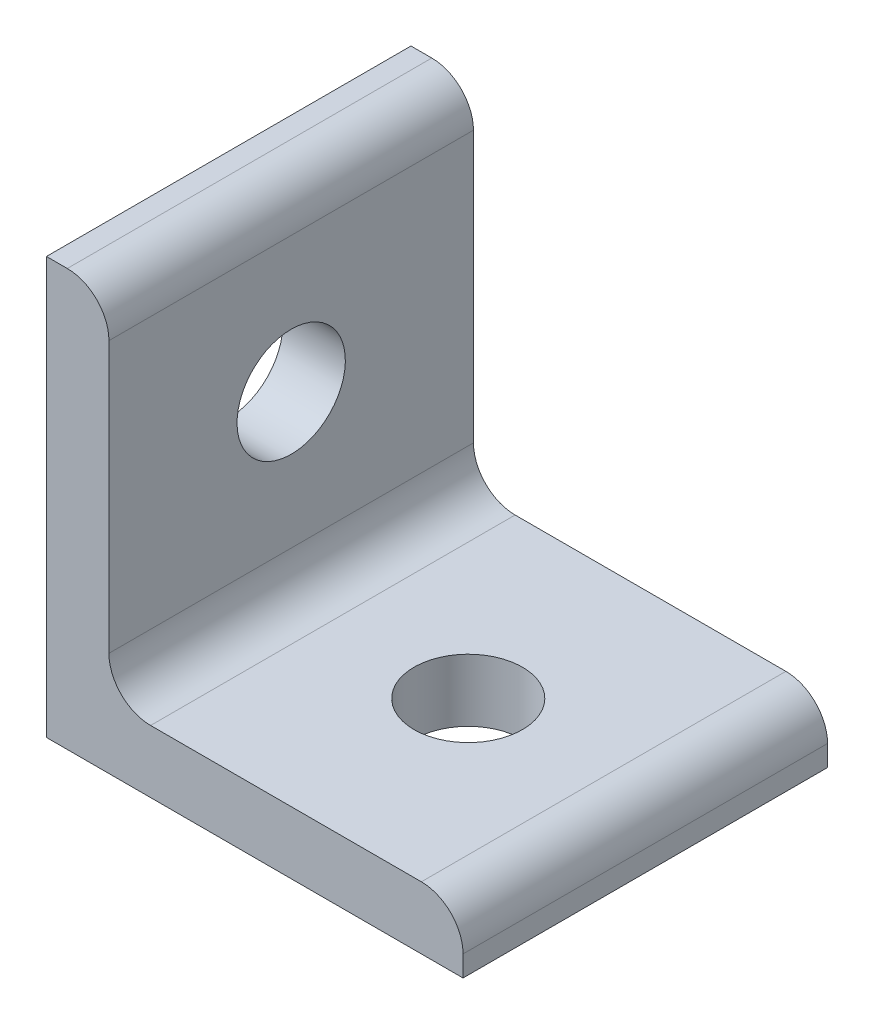
ISO-10303-21;
HEADER;
FILE_DESCRIPTION(('STEP AP214'),'2;1');
FILE_NAME('part.step','',(''),(''),'','','');
FILE_SCHEMA(('AUTOMOTIVE_DESIGN { 1 0 10303 214 1 1 1 1 }'));
ENDSEC;
DATA;
#1=APPLICATION_CONTEXT('core data for automotive mechanical design processes');
#2=APPLICATION_PROTOCOL_DEFINITION('international standard','automotive_design',2000,#1);
#3=PRODUCT_CONTEXT('',#1,'mechanical');
#4=PRODUCT('Part','Part','',(#3));
#5=PRODUCT_RELATED_PRODUCT_CATEGORY('part','',(#4));
#6=PRODUCT_DEFINITION_FORMATION('','',#4);
#7=PRODUCT_DEFINITION_CONTEXT('part definition',#1,'design');
#8=PRODUCT_DEFINITION('design','',#6,#7);
#9=PRODUCT_DEFINITION_SHAPE('','',#8);
#10=(LENGTH_UNIT() NAMED_UNIT(*) SI_UNIT(.MILLI.,.METRE.));
#11=(NAMED_UNIT(*) PLANE_ANGLE_UNIT() SI_UNIT($,.RADIAN.));
#12=(NAMED_UNIT(*) SI_UNIT($,.STERADIAN.) SOLID_ANGLE_UNIT());
#13=UNCERTAINTY_MEASURE_WITH_UNIT(LENGTH_MEASURE(1.E-05),#10,'distance_accuracy_value','');
#14=(GEOMETRIC_REPRESENTATION_CONTEXT(3) GLOBAL_UNCERTAINTY_ASSIGNED_CONTEXT((#13)) GLOBAL_UNIT_ASSIGNED_CONTEXT((#10,
#11,#12)) REPRESENTATION_CONTEXT('',''));
#15=CARTESIAN_POINT('',(0.,0.,0.));
#16=DIRECTION('',(0.,0.,1.));
#17=DIRECTION('',(1.,0.,0.));
#18=AXIS2_PLACEMENT_3D('',#15,#16,#17);
#19=CARTESIAN_POINT('',(-3.81,21.59,22.225));
#20=DIRECTION('',(0.,-1.,0.));
#21=DIRECTION('',(0.,0.,-1.));
#22=AXIS2_PLACEMENT_3D('',#19,#20,#21);
#23=PLANE('',#22);
#24=DIRECTION('',(-1.,0.,0.));
#25=VECTOR('',#24,1.);
#26=CARTESIAN_POINT('',(-3.81,21.59,22.225));
#27=LINE('',#26,#25);
#28=CARTESIAN_POINT('',(-2.54,21.59,22.225));
#29=VERTEX_POINT('',#28);
#30=CARTESIAN_POINT('',(-3.81,21.59,22.225));
#31=VERTEX_POINT('',#30);
#32=EDGE_CURVE('E114',#29,#31,#27,.T.);
#33=ORIENTED_EDGE('',*,*,#32,.F.);
#34=DIRECTION('',(0.,0.,-1.));
#35=VECTOR('',#34,1.);
#36=CARTESIAN_POINT('',(-2.54,21.59,22.225));
#37=LINE('',#36,#35);
#38=CARTESIAN_POINT('',(-2.54,21.59,0.));
#39=VERTEX_POINT('',#38);
#40=EDGE_CURVE('E173',#29,#39,#37,.T.);
#41=ORIENTED_EDGE('',*,*,#40,.T.);
#42=DIRECTION('',(-1.,0.,0.));
#43=VECTOR('',#42,1.);
#44=CARTESIAN_POINT('',(-3.81,21.59,0.));
#45=LINE('',#44,#43);
#46=CARTESIAN_POINT('',(-3.81,21.59,0.));
#47=VERTEX_POINT('',#46);
#48=EDGE_CURVE('E137',#39,#47,#45,.T.);
#49=ORIENTED_EDGE('',*,*,#48,.T.);
#50=DIRECTION('',(0.,0.,-1.));
#51=VECTOR('',#50,1.);
#52=CARTESIAN_POINT('',(-3.81,21.59,22.225));
#53=LINE('',#52,#51);
#54=EDGE_CURVE('E129',#31,#47,#53,.T.);
#55=ORIENTED_EDGE('',*,*,#54,.F.);
#56=EDGE_LOOP('',(#33,#41,#49,#55));
#57=FACE_BOUND('',#56,.T.);
#58=ADVANCED_FACE('F43',(#57),#23,.F.);
#59=CARTESIAN_POINT('',(-3.81,-3.81,22.225));
#60=DIRECTION('',(1.,0.,0.));
#61=DIRECTION('',(0.,1.,0.));
#62=AXIS2_PLACEMENT_3D('',#59,#60,#61);
#63=PLANE('',#62);
#64=CARTESIAN_POINT('',(-3.81,10.795,11.1125));
#65=DIRECTION('',(1.,0.,0.));
#66=DIRECTION('',(0.,1.,0.));
#67=AXIS2_PLACEMENT_3D('',#64,#65,#66);
#68=CIRCLE('',#67,3.302);
#69=CARTESIAN_POINT('',(-3.81,14.097,11.1125));
#70=VERTEX_POINT('',#69);
#71=EDGE_CURVE('E237',#70,#70,#68,.T.);
#72=ORIENTED_EDGE('',*,*,#71,.T.);
#73=EDGE_LOOP('',(#72));
#74=FACE_BOUND('',#73,.T.);
#75=DIRECTION('',(0.,-1.,0.));
#76=VECTOR('',#75,1.);
#77=CARTESIAN_POINT('',(-3.81,-3.81,0.));
#78=LINE('',#77,#76);
#79=CARTESIAN_POINT('',(-3.81,-3.81,0.));
#80=VERTEX_POINT('',#79);
#81=EDGE_CURVE('E213',#47,#80,#78,.T.);
#82=ORIENTED_EDGE('',*,*,#81,.T.);
#83=DIRECTION('',(0.,0.,-1.));
#84=VECTOR('',#83,1.);
#85=CARTESIAN_POINT('',(-3.81,-3.81,22.225));
#86=LINE('',#85,#84);
#87=CARTESIAN_POINT('',(-3.81,-3.81,22.225));
#88=VERTEX_POINT('',#87);
#89=EDGE_CURVE('E131',#88,#80,#86,.T.);
#90=ORIENTED_EDGE('',*,*,#89,.F.);
#91=DIRECTION('',(0.,-1.,0.));
#92=VECTOR('',#91,1.);
#93=CARTESIAN_POINT('',(-3.81,-3.81,22.225));
#94=LINE('',#93,#92);
#95=EDGE_CURVE('E117',#31,#88,#94,.T.);
#96=ORIENTED_EDGE('',*,*,#95,.F.);
#97=ORIENTED_EDGE('',*,*,#54,.T.);
#98=EDGE_LOOP('',(#82,#90,#96,#97));
#99=FACE_BOUND('',#98,.T.);
#100=ADVANCED_FACE('F128',(#74,#99),#63,.F.);
#101=CARTESIAN_POINT('',(21.59,-3.81,22.225));
#102=DIRECTION('',(0.,1.,0.));
#103=DIRECTION('',(-1.,0.,0.));
#104=AXIS2_PLACEMENT_3D('',#101,#102,#103);
#105=PLANE('',#104);
#106=CARTESIAN_POINT('',(10.795,-3.81,11.1125));
#107=DIRECTION('',(0.,1.,0.));
#108=DIRECTION('',(0.,0.,1.));
#109=AXIS2_PLACEMENT_3D('',#106,#107,#108);
#110=CIRCLE('',#109,3.302);
#111=CARTESIAN_POINT('',(10.795,-3.81,14.4145));
#112=VERTEX_POINT('',#111);
#113=EDGE_CURVE('E214',#112,#112,#110,.T.);
#114=ORIENTED_EDGE('',*,*,#113,.T.);
#115=EDGE_LOOP('',(#114));
#116=FACE_BOUND('',#115,.T.);
#117=DIRECTION('',(1.,0.,0.));
#118=VECTOR('',#117,1.);
#119=CARTESIAN_POINT('',(21.59,-3.81,0.));
#120=LINE('',#119,#118);
#121=CARTESIAN_POINT('',(21.59,-3.81,0.));
#122=VERTEX_POINT('',#121);
#123=EDGE_CURVE('E217',#80,#122,#120,.T.);
#124=ORIENTED_EDGE('',*,*,#123,.T.);
#125=DIRECTION('',(0.,0.,-1.));
#126=VECTOR('',#125,1.);
#127=CARTESIAN_POINT('',(21.59,-3.81,22.225));
#128=LINE('',#127,#126);
#129=CARTESIAN_POINT('',(21.59,-3.81,22.225));
#130=VERTEX_POINT('',#129);
#131=EDGE_CURVE('E146',#130,#122,#128,.T.);
#132=ORIENTED_EDGE('',*,*,#131,.F.);
#133=DIRECTION('',(1.,0.,0.));
#134=VECTOR('',#133,1.);
#135=CARTESIAN_POINT('',(21.59,-3.81,22.225));
#136=LINE('',#135,#134);
#137=EDGE_CURVE('E134',#88,#130,#136,.T.);
#138=ORIENTED_EDGE('',*,*,#137,.F.);
#139=ORIENTED_EDGE('',*,*,#89,.T.);
#140=EDGE_LOOP('',(#124,#132,#138,#139));
#141=FACE_BOUND('',#140,.T.);
#142=ADVANCED_FACE('F227',(#116,#141),#105,.F.);
#143=CARTESIAN_POINT('',(21.59,0.,22.225));
#144=DIRECTION('',(-1.,0.,0.));
#145=DIRECTION('',(0.,0.,1.));
#146=AXIS2_PLACEMENT_3D('',#143,#144,#145);
#147=PLANE('',#146);
#148=DIRECTION('',(0.,1.,0.));
#149=VECTOR('',#148,1.);
#150=CARTESIAN_POINT('',(21.59,0.,0.));
#151=LINE('',#150,#149);
#152=CARTESIAN_POINT('',(21.59,-2.54,0.));
#153=VERTEX_POINT('',#152);
#154=EDGE_CURVE('E192',#122,#153,#151,.T.);
#155=ORIENTED_EDGE('',*,*,#154,.T.);
#156=DIRECTION('',(0.,0.,-1.));
#157=VECTOR('',#156,1.);
#158=CARTESIAN_POINT('',(21.59,-2.54,22.225));
#159=LINE('',#158,#157);
#160=CARTESIAN_POINT('',(21.59,-2.54,22.225));
#161=VERTEX_POINT('',#160);
#162=EDGE_CURVE('E67',#153,#161,#159,.F.);
#163=ORIENTED_EDGE('',*,*,#162,.T.);
#164=DIRECTION('',(0.,1.,0.));
#165=VECTOR('',#164,1.);
#166=CARTESIAN_POINT('',(21.59,0.,22.225));
#167=LINE('',#166,#165);
#168=EDGE_CURVE('E207',#130,#161,#167,.T.);
#169=ORIENTED_EDGE('',*,*,#168,.F.);
#170=ORIENTED_EDGE('',*,*,#131,.T.);
#171=EDGE_LOOP('',(#155,#163,#169,#170));
#172=FACE_BOUND('',#171,.T.);
#173=ADVANCED_FACE('F264',(#172),#147,.F.);
#174=CARTESIAN_POINT('',(0.,0.,22.225));
#175=DIRECTION('',(0.,-1.,0.));
#176=DIRECTION('',(0.,0.,-1.));
#177=AXIS2_PLACEMENT_3D('',#174,#175,#176);
#178=PLANE('',#177);
#179=CARTESIAN_POINT('',(10.795,0.,11.1125));
#180=DIRECTION('',(0.,1.,0.));
#181=DIRECTION('',(0.,0.,1.));
#182=AXIS2_PLACEMENT_3D('',#179,#180,#181);
#183=CIRCLE('',#182,3.302);
#184=CARTESIAN_POINT('',(10.795,0.,14.4145));
#185=VERTEX_POINT('',#184);
#186=EDGE_CURVE('E233',#185,#185,#183,.T.);
#187=ORIENTED_EDGE('',*,*,#186,.F.);
#188=EDGE_LOOP('',(#187));
#189=FACE_BOUND('',#188,.T.);
#190=DIRECTION('',(-1.,0.,0.));
#191=VECTOR('',#190,1.);
#192=CARTESIAN_POINT('',(0.,0.,0.));
#193=LINE('',#192,#191);
#194=CARTESIAN_POINT('',(19.05,0.,0.));
#195=VERTEX_POINT('',#194);
#196=CARTESIAN_POINT('',(2.54,0.,0.));
#197=VERTEX_POINT('',#196);
#198=EDGE_CURVE('E181',#195,#197,#193,.T.);
#199=ORIENTED_EDGE('',*,*,#198,.T.);
#200=DIRECTION('',(0.,0.,-1.));
#201=VECTOR('',#200,1.);
#202=CARTESIAN_POINT('',(2.54,0.,22.225));
#203=LINE('',#202,#201);
#204=CARTESIAN_POINT('',(2.54,0.,22.225));
#205=VERTEX_POINT('',#204);
#206=EDGE_CURVE('E157',#197,#205,#203,.F.);
#207=ORIENTED_EDGE('',*,*,#206,.T.);
#208=DIRECTION('',(-1.,0.,0.));
#209=VECTOR('',#208,1.);
#210=CARTESIAN_POINT('',(0.,0.,22.225));
#211=LINE('',#210,#209);
#212=CARTESIAN_POINT('',(19.05,0.,22.225));
#213=VERTEX_POINT('',#212);
#214=EDGE_CURVE('E198',#213,#205,#211,.T.);
#215=ORIENTED_EDGE('',*,*,#214,.F.);
#216=DIRECTION('',(0.,0.,-1.));
#217=VECTOR('',#216,1.);
#218=CARTESIAN_POINT('',(19.05,0.,22.225));
#219=LINE('',#218,#217);
#220=EDGE_CURVE('E153',#213,#195,#219,.T.);
#221=ORIENTED_EDGE('',*,*,#220,.T.);
#222=EDGE_LOOP('',(#199,#207,#215,#221));
#223=FACE_BOUND('',#222,.T.);
#224=ADVANCED_FACE('F187',(#189,#223),#178,.F.);
#225=CARTESIAN_POINT('',(0.,21.59,22.225));
#226=DIRECTION('',(-1.,0.,0.));
#227=DIRECTION('',(0.,-1.,0.));
#228=AXIS2_PLACEMENT_3D('',#225,#226,#227);
#229=PLANE('',#228);
#230=CARTESIAN_POINT('',(0.,10.795,11.1125));
#231=DIRECTION('',(1.,0.,0.));
#232=DIRECTION('',(0.,1.,0.));
#233=AXIS2_PLACEMENT_3D('',#230,#231,#232);
#234=CIRCLE('',#233,3.302);
#235=CARTESIAN_POINT('',(0.,14.097,11.1125));
#236=VERTEX_POINT('',#235);
#237=EDGE_CURVE('E241',#236,#236,#234,.T.);
#238=ORIENTED_EDGE('',*,*,#237,.F.);
#239=EDGE_LOOP('',(#238));
#240=FACE_BOUND('',#239,.T.);
#241=DIRECTION('',(0.,1.,0.));
#242=VECTOR('',#241,1.);
#243=CARTESIAN_POINT('',(0.,21.59,22.225));
#244=LINE('',#243,#242);
#245=CARTESIAN_POINT('',(0.,2.54,22.225));
#246=VERTEX_POINT('',#245);
#247=CARTESIAN_POINT('',(0.,19.05,22.225));
#248=VERTEX_POINT('',#247);
#249=EDGE_CURVE('E197',#246,#248,#244,.T.);
#250=ORIENTED_EDGE('',*,*,#249,.F.);
#251=DIRECTION('',(0.,0.,-1.));
#252=VECTOR('',#251,1.);
#253=CARTESIAN_POINT('',(0.,2.54,0.));
#254=LINE('',#253,#252);
#255=CARTESIAN_POINT('',(0.,2.54,0.));
#256=VERTEX_POINT('',#255);
#257=EDGE_CURVE('E144',#246,#256,#254,.T.);
#258=ORIENTED_EDGE('',*,*,#257,.T.);
#259=DIRECTION('',(0.,1.,0.));
#260=VECTOR('',#259,1.);
#261=CARTESIAN_POINT('',(0.,21.59,0.));
#262=LINE('',#261,#260);
#263=CARTESIAN_POINT('',(0.,19.05,0.));
#264=VERTEX_POINT('',#263);
#265=EDGE_CURVE('E124',#256,#264,#262,.T.);
#266=ORIENTED_EDGE('',*,*,#265,.T.);
#267=DIRECTION('',(0.,0.,-1.));
#268=VECTOR('',#267,1.);
#269=CARTESIAN_POINT('',(0.,19.05,22.225));
#270=LINE('',#269,#268);
#271=EDGE_CURVE('E140',#264,#248,#270,.F.);
#272=ORIENTED_EDGE('',*,*,#271,.T.);
#273=EDGE_LOOP('',(#250,#258,#266,#272));
#274=FACE_BOUND('',#273,.T.);
#275=ADVANCED_FACE('F200',(#240,#274),#229,.F.);
#276=CARTESIAN_POINT('',(0.,0.,22.225));
#277=DIRECTION('',(0.,0.,-1.));
#278=DIRECTION('',(-1.,0.,0.));
#279=AXIS2_PLACEMENT_3D('',#276,#277,#278);
#280=PLANE('',#279);
#281=ORIENTED_EDGE('',*,*,#168,.T.);
#282=CARTESIAN_POINT('',(19.05,-2.54,22.225));
#283=DIRECTION('',(0.,0.,-1.));
#284=DIRECTION('',(-1.,0.,0.));
#285=AXIS2_PLACEMENT_3D('',#282,#283,#284);
#286=CIRCLE('',#285,2.54);
#287=EDGE_CURVE('E170',#161,#213,#286,.F.);
#288=ORIENTED_EDGE('',*,*,#287,.T.);
#289=ORIENTED_EDGE('',*,*,#214,.T.);
#290=CARTESIAN_POINT('',(2.54,2.54,22.225));
#291=DIRECTION('',(0.,0.,-1.));
#292=DIRECTION('',(-1.,0.,0.));
#293=AXIS2_PLACEMENT_3D('',#290,#291,#292);
#294=CIRCLE('',#293,2.54);
#295=EDGE_CURVE('E11',#205,#246,#294,.T.);
#296=ORIENTED_EDGE('',*,*,#295,.T.);
#297=ORIENTED_EDGE('',*,*,#249,.T.);
#298=CARTESIAN_POINT('',(-2.54,19.05,22.225));
#299=DIRECTION('',(0.,0.,-1.));
#300=DIRECTION('',(-1.,0.,0.));
#301=AXIS2_PLACEMENT_3D('',#298,#299,#300);
#302=CIRCLE('',#301,2.54);
#303=EDGE_CURVE('E59',#248,#29,#302,.F.);
#304=ORIENTED_EDGE('',*,*,#303,.T.);
#305=ORIENTED_EDGE('',*,*,#32,.T.);
#306=ORIENTED_EDGE('',*,*,#95,.T.);
#307=ORIENTED_EDGE('',*,*,#137,.T.);
#308=EDGE_LOOP('',(#281,#288,#289,#296,#297,#304,#305,#306,#307));
#309=FACE_BOUND('',#308,.T.);
#310=ADVANCED_FACE('F116',(#309),#280,.F.);
#311=CARTESIAN_POINT('',(0.,0.,0.));
#312=DIRECTION('',(0.,0.,-1.));
#313=DIRECTION('',(-1.,0.,0.));
#314=AXIS2_PLACEMENT_3D('',#311,#312,#313);
#315=PLANE('',#314);
#316=ORIENTED_EDGE('',*,*,#198,.F.);
#317=CARTESIAN_POINT('',(19.05,-2.54,0.));
#318=DIRECTION('',(0.,0.,-1.));
#319=DIRECTION('',(-1.,0.,0.));
#320=AXIS2_PLACEMENT_3D('',#317,#318,#319);
#321=CIRCLE('',#320,2.54);
#322=EDGE_CURVE('E163',#195,#153,#321,.T.);
#323=ORIENTED_EDGE('',*,*,#322,.T.);
#324=ORIENTED_EDGE('',*,*,#154,.F.);
#325=ORIENTED_EDGE('',*,*,#123,.F.);
#326=ORIENTED_EDGE('',*,*,#81,.F.);
#327=ORIENTED_EDGE('',*,*,#48,.F.);
#328=CARTESIAN_POINT('',(-2.54,19.05,0.));
#329=DIRECTION('',(0.,0.,-1.));
#330=DIRECTION('',(-1.,0.,0.));
#331=AXIS2_PLACEMENT_3D('',#328,#329,#330);
#332=CIRCLE('',#331,2.54);
#333=EDGE_CURVE('E160',#39,#264,#332,.T.);
#334=ORIENTED_EDGE('',*,*,#333,.T.);
#335=ORIENTED_EDGE('',*,*,#265,.F.);
#336=CARTESIAN_POINT('',(2.54,2.54,0.));
#337=DIRECTION('',(0.,0.,-1.));
#338=DIRECTION('',(-1.,0.,0.));
#339=AXIS2_PLACEMENT_3D('',#336,#337,#338);
#340=CIRCLE('',#339,2.54);
#341=EDGE_CURVE('E52',#256,#197,#340,.F.);
#342=ORIENTED_EDGE('',*,*,#341,.T.);
#343=EDGE_LOOP('',(#316,#323,#324,#325,#326,#327,#334,#335,#342));
#344=FACE_BOUND('',#343,.T.);
#345=ADVANCED_FACE('F180',(#344),#315,.T.);
#346=CARTESIAN_POINT('',(10.795,-3.81,11.1125));
#347=DIRECTION('',(0.,1.,0.));
#348=DIRECTION('',(0.,0.,1.));
#349=AXIS2_PLACEMENT_3D('',#346,#347,#348);
#350=CYLINDRICAL_SURFACE('',#349,3.302);
#351=ORIENTED_EDGE('',*,*,#113,.F.);
#352=EDGE_LOOP('',(#351));
#353=FACE_BOUND('',#352,.T.);
#354=ORIENTED_EDGE('',*,*,#186,.T.);
#355=EDGE_LOOP('',(#354));
#356=FACE_BOUND('',#355,.T.);
#357=ADVANCED_FACE('F253',(#353,#356),#350,.F.);
#358=CARTESIAN_POINT('',(-3.81,10.795,11.1125));
#359=DIRECTION('',(1.,0.,0.));
#360=DIRECTION('',(0.,1.,0.));
#361=AXIS2_PLACEMENT_3D('',#358,#359,#360);
#362=CYLINDRICAL_SURFACE('',#361,3.302);
#363=ORIENTED_EDGE('',*,*,#71,.F.);
#364=EDGE_LOOP('',(#363));
#365=FACE_BOUND('',#364,.T.);
#366=ORIENTED_EDGE('',*,*,#237,.T.);
#367=EDGE_LOOP('',(#366));
#368=FACE_BOUND('',#367,.T.);
#369=ADVANCED_FACE('F250',(#365,#368),#362,.F.);
#370=CARTESIAN_POINT('',(2.54,2.54,22.225));
#371=DIRECTION('',(0.,0.,1.));
#372=DIRECTION('',(1.,0.,0.));
#373=AXIS2_PLACEMENT_3D('',#370,#371,#372);
#374=CYLINDRICAL_SURFACE('',#373,2.54);
#375=ORIENTED_EDGE('',*,*,#295,.F.);
#376=ORIENTED_EDGE('',*,*,#206,.F.);
#377=ORIENTED_EDGE('',*,*,#341,.F.);
#378=ORIENTED_EDGE('',*,*,#257,.F.);
#379=EDGE_LOOP('',(#375,#376,#377,#378));
#380=FACE_BOUND('',#379,.T.);
#381=ADVANCED_FACE('F195',(#380),#374,.F.);
#382=CARTESIAN_POINT('',(19.05,-2.54,22.225));
#383=DIRECTION('',(0.,0.,-1.));
#384=DIRECTION('',(-1.,0.,0.));
#385=AXIS2_PLACEMENT_3D('',#382,#383,#384);
#386=CYLINDRICAL_SURFACE('',#385,2.54);
#387=ORIENTED_EDGE('',*,*,#287,.F.);
#388=ORIENTED_EDGE('',*,*,#162,.F.);
#389=ORIENTED_EDGE('',*,*,#322,.F.);
#390=ORIENTED_EDGE('',*,*,#220,.F.);
#391=EDGE_LOOP('',(#387,#388,#389,#390));
#392=FACE_BOUND('',#391,.T.);
#393=ADVANCED_FACE('F277',(#392),#386,.T.);
#394=CARTESIAN_POINT('',(-2.54,19.05,22.225));
#395=DIRECTION('',(0.,0.,-1.));
#396=DIRECTION('',(-1.,0.,0.));
#397=AXIS2_PLACEMENT_3D('',#394,#395,#396);
#398=CYLINDRICAL_SURFACE('',#397,2.54);
#399=ORIENTED_EDGE('',*,*,#303,.F.);
#400=ORIENTED_EDGE('',*,*,#271,.F.);
#401=ORIENTED_EDGE('',*,*,#333,.F.);
#402=ORIENTED_EDGE('',*,*,#40,.F.);
#403=EDGE_LOOP('',(#399,#400,#401,#402));
#404=FACE_BOUND('',#403,.T.);
#405=ADVANCED_FACE('F45',(#404),#398,.T.);
#406=CLOSED_SHELL('',(#58,#100,#142,#173,#224,#275,#310,#345,#357,#369,#381,#393,#405));
#407=MANIFOLD_SOLID_BREP('B2',#406);
#408=ADVANCED_BREP_SHAPE_REPRESENTATION('',(#18,#407),#14);
#409=SHAPE_DEFINITION_REPRESENTATION(#9,#408);
ENDSEC;
END-ISO-10303-21;
